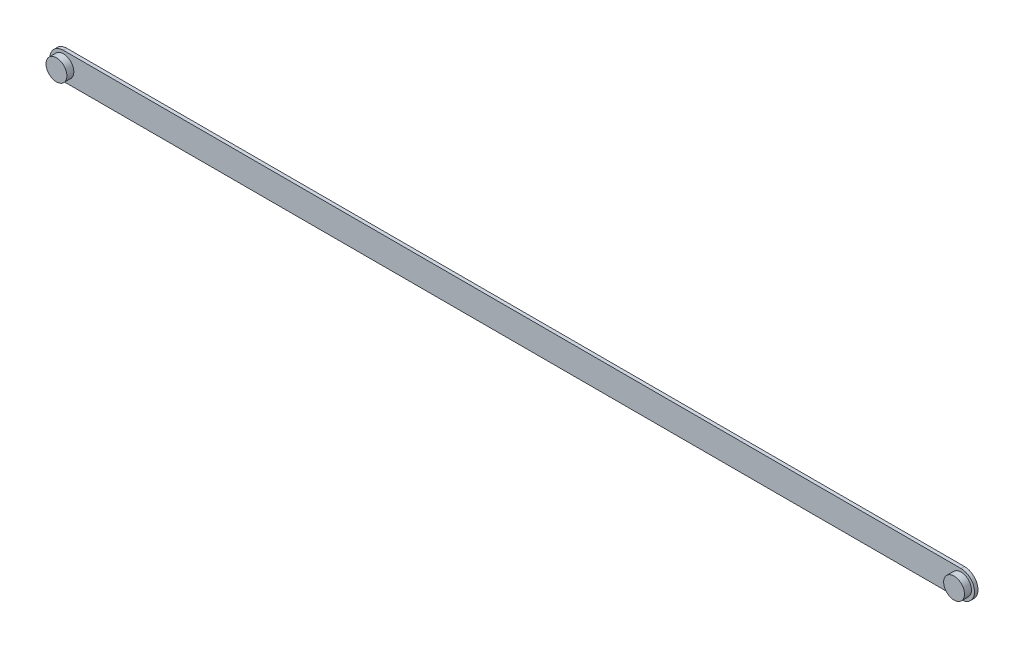
ISO-10303-21;
HEADER;
FILE_DESCRIPTION(('STEP AP214'),'2;1');
FILE_NAME('part.step','',(''),(''),'','','');
FILE_SCHEMA(('AUTOMOTIVE_DESIGN { 1 0 10303 214 1 1 1 1 }'));
ENDSEC;
DATA;
#1=APPLICATION_CONTEXT('core data for automotive mechanical design processes');
#2=APPLICATION_PROTOCOL_DEFINITION('international standard','automotive_design',2000,#1);
#3=PRODUCT_CONTEXT('',#1,'mechanical');
#4=PRODUCT('Part','Part','',(#3));
#5=PRODUCT_RELATED_PRODUCT_CATEGORY('part','',(#4));
#6=PRODUCT_DEFINITION_FORMATION('','',#4);
#7=PRODUCT_DEFINITION_CONTEXT('part definition',#1,'design');
#8=PRODUCT_DEFINITION('design','',#6,#7);
#9=PRODUCT_DEFINITION_SHAPE('','',#8);
#10=(LENGTH_UNIT() NAMED_UNIT(*) SI_UNIT(.MILLI.,.METRE.));
#11=(NAMED_UNIT(*) PLANE_ANGLE_UNIT() SI_UNIT($,.RADIAN.));
#12=(NAMED_UNIT(*) SI_UNIT($,.STERADIAN.) SOLID_ANGLE_UNIT());
#13=UNCERTAINTY_MEASURE_WITH_UNIT(LENGTH_MEASURE(1.E-05),#10,'distance_accuracy_value','');
#14=(GEOMETRIC_REPRESENTATION_CONTEXT(3) GLOBAL_UNCERTAINTY_ASSIGNED_CONTEXT((#13)) GLOBAL_UNIT_ASSIGNED_CONTEXT((#10,
#11,#12)) REPRESENTATION_CONTEXT('',''));
#15=CARTESIAN_POINT('',(0.,0.,0.));
#16=DIRECTION('',(0.,0.,1.));
#17=DIRECTION('',(1.,0.,0.));
#18=AXIS2_PLACEMENT_3D('',#15,#16,#17);
#19=CARTESIAN_POINT('',(0.,0.,1.));
#20=DIRECTION('',(0.,0.,-1.));
#21=DIRECTION('',(-1.,0.,0.));
#22=AXIS2_PLACEMENT_3D('',#19,#20,#21);
#23=CYLINDRICAL_SURFACE('',#22,3.87478892529486);
#24=CARTESIAN_POINT('',(0.,0.,0.));
#25=DIRECTION('',(0.,0.,1.));
#26=DIRECTION('',(1.,0.,0.));
#27=AXIS2_PLACEMENT_3D('',#24,#25,#26);
#28=CIRCLE('',#27,3.87478892529486);
#29=CARTESIAN_POINT('',(0.,-3.87478892529486,0.));
#30=VERTEX_POINT('',#29);
#31=CARTESIAN_POINT('',(0.,3.87478892529486,0.));
#32=VERTEX_POINT('',#31);
#33=EDGE_CURVE('E113',#30,#32,#28,.T.);
#34=ORIENTED_EDGE('',*,*,#33,.T.);
#35=DIRECTION('',(0.,0.,-1.));
#36=VECTOR('',#35,1.);
#37=CARTESIAN_POINT('',(0.,3.87478892529486,1.));
#38=LINE('',#37,#36);
#39=CARTESIAN_POINT('',(0.,3.87478892529486,1.));
#40=VERTEX_POINT('',#39);
#41=EDGE_CURVE('E11',#40,#32,#38,.T.);
#42=ORIENTED_EDGE('',*,*,#41,.F.);
#43=CARTESIAN_POINT('',(0.,0.,1.));
#44=DIRECTION('',(0.,0.,1.));
#45=DIRECTION('',(1.,0.,0.));
#46=AXIS2_PLACEMENT_3D('',#43,#44,#45);
#47=CIRCLE('',#46,3.87478892529486);
#48=CARTESIAN_POINT('',(0.,-3.87478892529486,1.));
#49=VERTEX_POINT('',#48);
#50=EDGE_CURVE('E97',#49,#40,#47,.T.);
#51=ORIENTED_EDGE('',*,*,#50,.F.);
#52=DIRECTION('',(0.,0.,-1.));
#53=VECTOR('',#52,1.);
#54=CARTESIAN_POINT('',(0.,-3.87478892529486,1.));
#55=LINE('',#54,#53);
#56=EDGE_CURVE('E109',#49,#30,#55,.T.);
#57=ORIENTED_EDGE('',*,*,#56,.T.);
#58=EDGE_LOOP('',(#34,#42,#51,#57));
#59=FACE_BOUND('',#58,.T.);
#60=ADVANCED_FACE('F45',(#59),#23,.T.);
#61=CARTESIAN_POINT('',(0.,3.87478892529486,1.));
#62=DIRECTION('',(0.,-1.,0.));
#63=DIRECTION('',(0.,0.,-1.));
#64=AXIS2_PLACEMENT_3D('',#61,#62,#63);
#65=PLANE('',#64);
#66=DIRECTION('',(-1.,0.,0.));
#67=VECTOR('',#66,1.);
#68=CARTESIAN_POINT('',(0.,3.87478892529486,0.));
#69=LINE('',#68,#67);
#70=CARTESIAN_POINT('',(-258.053276247999,3.87478892529486,0.));
#71=VERTEX_POINT('',#70);
#72=EDGE_CURVE('E102',#32,#71,#69,.T.);
#73=ORIENTED_EDGE('',*,*,#72,.T.);
#74=DIRECTION('',(0.,0.,-1.));
#75=VECTOR('',#74,1.);
#76=CARTESIAN_POINT('',(-258.053276247999,3.87478892529486,1.));
#77=LINE('',#76,#75);
#78=CARTESIAN_POINT('',(-258.053276247999,3.87478892529486,1.));
#79=VERTEX_POINT('',#78);
#80=EDGE_CURVE('E54',#79,#71,#77,.T.);
#81=ORIENTED_EDGE('',*,*,#80,.F.);
#82=DIRECTION('',(-1.,0.,0.));
#83=VECTOR('',#82,1.);
#84=CARTESIAN_POINT('',(0.,3.87478892529486,1.));
#85=LINE('',#84,#83);
#86=EDGE_CURVE('E92',#40,#79,#85,.T.);
#87=ORIENTED_EDGE('',*,*,#86,.F.);
#88=ORIENTED_EDGE('',*,*,#41,.T.);
#89=EDGE_LOOP('',(#73,#81,#87,#88));
#90=FACE_BOUND('',#89,.T.);
#91=ADVANCED_FACE('F101',(#90),#65,.F.);
#92=CARTESIAN_POINT('',(-258.053276247999,0.,1.));
#93=DIRECTION('',(0.,0.,-1.));
#94=DIRECTION('',(-1.,0.,0.));
#95=AXIS2_PLACEMENT_3D('',#92,#93,#94);
#96=CYLINDRICAL_SURFACE('',#95,3.87478892529486);
#97=CARTESIAN_POINT('',(-258.053276247999,0.,0.));
#98=DIRECTION('',(0.,0.,1.));
#99=DIRECTION('',(1.,0.,0.));
#100=AXIS2_PLACEMENT_3D('',#97,#98,#99);
#101=CIRCLE('',#100,3.87478892529486);
#102=CARTESIAN_POINT('',(-258.053276247999,-3.87478892529486,0.));
#103=VERTEX_POINT('',#102);
#104=EDGE_CURVE('E79',#71,#103,#101,.T.);
#105=ORIENTED_EDGE('',*,*,#104,.T.);
#106=DIRECTION('',(0.,0.,-1.));
#107=VECTOR('',#106,1.);
#108=CARTESIAN_POINT('',(-258.053276247999,-3.87478892529486,1.));
#109=LINE('',#108,#107);
#110=CARTESIAN_POINT('',(-258.053276247999,-3.87478892529486,1.));
#111=VERTEX_POINT('',#110);
#112=EDGE_CURVE('E104',#111,#103,#109,.T.);
#113=ORIENTED_EDGE('',*,*,#112,.F.);
#114=CARTESIAN_POINT('',(-258.053276247999,0.,1.));
#115=DIRECTION('',(0.,0.,1.));
#116=DIRECTION('',(1.,0.,0.));
#117=AXIS2_PLACEMENT_3D('',#114,#115,#116);
#118=CIRCLE('',#117,3.87478892529486);
#119=EDGE_CURVE('E95',#79,#111,#118,.T.);
#120=ORIENTED_EDGE('',*,*,#119,.F.);
#121=ORIENTED_EDGE('',*,*,#80,.T.);
#122=EDGE_LOOP('',(#105,#113,#120,#121));
#123=FACE_BOUND('',#122,.T.);
#124=ADVANCED_FACE('F105',(#123),#96,.T.);
#125=CARTESIAN_POINT('',(0.,-3.87478892529486,1.));
#126=DIRECTION('',(0.,1.,0.));
#127=DIRECTION('',(0.,0.,1.));
#128=AXIS2_PLACEMENT_3D('',#125,#126,#127);
#129=PLANE('',#128);
#130=DIRECTION('',(1.,0.,0.));
#131=VECTOR('',#130,1.);
#132=CARTESIAN_POINT('',(0.,-3.87478892529486,0.));
#133=LINE('',#132,#131);
#134=EDGE_CURVE('E85',#103,#30,#133,.T.);
#135=ORIENTED_EDGE('',*,*,#134,.T.);
#136=ORIENTED_EDGE('',*,*,#56,.F.);
#137=DIRECTION('',(1.,0.,0.));
#138=VECTOR('',#137,1.);
#139=CARTESIAN_POINT('',(0.,-3.87478892529486,1.));
#140=LINE('',#139,#138);
#141=EDGE_CURVE('E62',#111,#49,#140,.T.);
#142=ORIENTED_EDGE('',*,*,#141,.F.);
#143=ORIENTED_EDGE('',*,*,#112,.T.);
#144=EDGE_LOOP('',(#135,#136,#142,#143));
#145=FACE_BOUND('',#144,.T.);
#146=ADVANCED_FACE('F127',(#145),#129,.F.);
#147=CARTESIAN_POINT('',(0.,0.,1.));
#148=DIRECTION('',(0.,0.,1.));
#149=DIRECTION('',(1.,0.,0.));
#150=AXIS2_PLACEMENT_3D('',#147,#148,#149);
#151=PLANE('',#150);
#152=CARTESIAN_POINT('',(-258.053276247999,0.,1.));
#153=DIRECTION('',(0.,0.,1.));
#154=DIRECTION('',(1.,0.,0.));
#155=AXIS2_PLACEMENT_3D('',#152,#153,#154);
#156=CIRCLE('',#155,2.99999999999999);
#157=CARTESIAN_POINT('',(-255.053276247999,0.,1.));
#158=VERTEX_POINT('',#157);
#159=EDGE_CURVE('E142',#158,#158,#156,.T.);
#160=ORIENTED_EDGE('',*,*,#159,.F.);
#161=EDGE_LOOP('',(#160));
#162=FACE_BOUND('',#161,.T.);
#163=CARTESIAN_POINT('',(0.,0.,1.));
#164=DIRECTION('',(0.,0.,1.));
#165=DIRECTION('',(1.,0.,0.));
#166=AXIS2_PLACEMENT_3D('',#163,#164,#165);
#167=CIRCLE('',#166,3.);
#168=CARTESIAN_POINT('',(3.,0.,1.));
#169=VERTEX_POINT('',#168);
#170=EDGE_CURVE('E134',#169,#169,#167,.T.);
#171=ORIENTED_EDGE('',*,*,#170,.F.);
#172=EDGE_LOOP('',(#171));
#173=FACE_BOUND('',#172,.T.);
#174=ORIENTED_EDGE('',*,*,#50,.T.);
#175=ORIENTED_EDGE('',*,*,#86,.T.);
#176=ORIENTED_EDGE('',*,*,#119,.T.);
#177=ORIENTED_EDGE('',*,*,#141,.T.);
#178=EDGE_LOOP('',(#174,#175,#176,#177));
#179=FACE_BOUND('',#178,.T.);
#180=ADVANCED_FACE('F93',(#162,#173,#179),#151,.T.);
#181=CARTESIAN_POINT('',(0.,0.,0.));
#182=DIRECTION('',(0.,0.,1.));
#183=DIRECTION('',(1.,0.,0.));
#184=AXIS2_PLACEMENT_3D('',#181,#182,#183);
#185=PLANE('',#184);
#186=ORIENTED_EDGE('',*,*,#33,.F.);
#187=ORIENTED_EDGE('',*,*,#134,.F.);
#188=ORIENTED_EDGE('',*,*,#104,.F.);
#189=ORIENTED_EDGE('',*,*,#72,.F.);
#190=EDGE_LOOP('',(#186,#187,#188,#189));
#191=FACE_BOUND('',#190,.T.);
#192=ADVANCED_FACE('F130',(#191),#185,.F.);
#193=CARTESIAN_POINT('',(0.,0.,3.));
#194=DIRECTION('',(0.,0.,-1.));
#195=DIRECTION('',(-1.,0.,0.));
#196=AXIS2_PLACEMENT_3D('',#193,#194,#195);
#197=CYLINDRICAL_SURFACE('',#196,3.);
#198=CARTESIAN_POINT('',(0.,0.,3.));
#199=DIRECTION('',(0.,0.,1.));
#200=DIRECTION('',(1.,0.,0.));
#201=AXIS2_PLACEMENT_3D('',#198,#199,#200);
#202=CIRCLE('',#201,3.);
#203=CARTESIAN_POINT('',(3.,0.,3.));
#204=VERTEX_POINT('',#203);
#205=EDGE_CURVE('E117',#204,#204,#202,.T.);
#206=ORIENTED_EDGE('',*,*,#205,.F.);
#207=EDGE_LOOP('',(#206));
#208=FACE_BOUND('',#207,.T.);
#209=ORIENTED_EDGE('',*,*,#170,.T.);
#210=EDGE_LOOP('',(#209));
#211=FACE_BOUND('',#210,.T.);
#212=ADVANCED_FACE('F164',(#208,#211),#197,.T.);
#213=CARTESIAN_POINT('',(0.,0.,3.));
#214=DIRECTION('',(0.,0.,1.));
#215=DIRECTION('',(1.,0.,0.));
#216=AXIS2_PLACEMENT_3D('',#213,#214,#215);
#217=PLANE('',#216);
#218=ORIENTED_EDGE('',*,*,#205,.T.);
#219=EDGE_LOOP('',(#218));
#220=FACE_BOUND('',#219,.T.);
#221=ADVANCED_FACE('F155',(#220),#217,.T.);
#222=CARTESIAN_POINT('',(-258.053276247999,0.,3.));
#223=DIRECTION('',(0.,0.,-1.));
#224=DIRECTION('',(-1.,0.,0.));
#225=AXIS2_PLACEMENT_3D('',#222,#223,#224);
#226=CYLINDRICAL_SURFACE('',#225,2.99999999999999);
#227=CARTESIAN_POINT('',(-258.053276247999,0.,3.));
#228=DIRECTION('',(0.,0.,1.));
#229=DIRECTION('',(1.,0.,0.));
#230=AXIS2_PLACEMENT_3D('',#227,#228,#229);
#231=CIRCLE('',#230,2.99999999999999);
#232=CARTESIAN_POINT('',(-255.053276247999,0.,3.));
#233=VERTEX_POINT('',#232);
#234=EDGE_CURVE('E138',#233,#233,#231,.T.);
#235=ORIENTED_EDGE('',*,*,#234,.F.);
#236=EDGE_LOOP('',(#235));
#237=FACE_BOUND('',#236,.T.);
#238=ORIENTED_EDGE('',*,*,#159,.T.);
#239=EDGE_LOOP('',(#238));
#240=FACE_BOUND('',#239,.T.);
#241=ADVANCED_FACE('F152',(#237,#240),#226,.T.);
#242=CARTESIAN_POINT('',(-258.053276247999,0.,3.));
#243=DIRECTION('',(0.,0.,1.));
#244=DIRECTION('',(1.,0.,0.));
#245=AXIS2_PLACEMENT_3D('',#242,#243,#244);
#246=PLANE('',#245);
#247=ORIENTED_EDGE('',*,*,#234,.T.);
#248=EDGE_LOOP('',(#247));
#249=FACE_BOUND('',#248,.T.);
#250=ADVANCED_FACE('F150',(#249),#246,.T.);
#251=CLOSED_SHELL('',(#60,#91,#124,#146,#180,#192,#212,#221,#241,#250));
#252=MANIFOLD_SOLID_BREP('B2',#251);
#253=ADVANCED_BREP_SHAPE_REPRESENTATION('',(#18,#252),#14);
#254=SHAPE_DEFINITION_REPRESENTATION(#9,#253);
ENDSEC;
END-ISO-10303-21;
